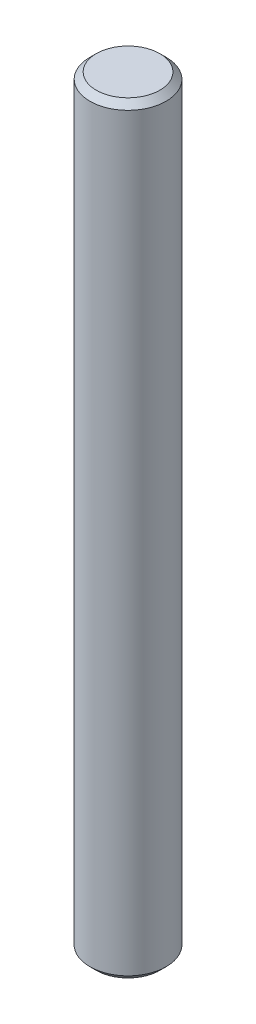
ISO-10303-21;
HEADER;
FILE_DESCRIPTION(('STEP AP214'),'2;1');
FILE_NAME('part.step','',(''),(''),'','','');
FILE_SCHEMA(('AUTOMOTIVE_DESIGN { 1 0 10303 214 1 1 1 1 }'));
ENDSEC;
DATA;
#1=APPLICATION_CONTEXT('core data for automotive mechanical design processes');
#2=APPLICATION_PROTOCOL_DEFINITION('international standard','automotive_design',2000,#1);
#3=PRODUCT_CONTEXT('',#1,'mechanical');
#4=PRODUCT('Part','Part','',(#3));
#5=PRODUCT_RELATED_PRODUCT_CATEGORY('part','',(#4));
#6=PRODUCT_DEFINITION_FORMATION('','',#4);
#7=PRODUCT_DEFINITION_CONTEXT('part definition',#1,'design');
#8=PRODUCT_DEFINITION('design','',#6,#7);
#9=PRODUCT_DEFINITION_SHAPE('','',#8);
#10=(LENGTH_UNIT() NAMED_UNIT(*) SI_UNIT(.MILLI.,.METRE.));
#11=(NAMED_UNIT(*) PLANE_ANGLE_UNIT() SI_UNIT($,.RADIAN.));
#12=(NAMED_UNIT(*) SI_UNIT($,.STERADIAN.) SOLID_ANGLE_UNIT());
#13=UNCERTAINTY_MEASURE_WITH_UNIT(LENGTH_MEASURE(1.E-05),#10,'distance_accuracy_value','');
#14=(GEOMETRIC_REPRESENTATION_CONTEXT(3) GLOBAL_UNCERTAINTY_ASSIGNED_CONTEXT((#13)) GLOBAL_UNIT_ASSIGNED_CONTEXT((#10,
#11,#12)) REPRESENTATION_CONTEXT('',''));
#15=CARTESIAN_POINT('',(0.,0.,0.));
#16=DIRECTION('',(0.,0.,1.));
#17=DIRECTION('',(1.,0.,0.));
#18=AXIS2_PLACEMENT_3D('',#15,#16,#17);
#19=CARTESIAN_POINT('',(0.,30.,6.5));
#20=DIRECTION('',(0.,-1.,0.));
#21=DIRECTION('',(0.,0.,-1.));
#22=AXIS2_PLACEMENT_3D('',#19,#20,#21);
#23=CONICAL_SURFACE('',#22,2.5,0.785398163397446);
#24=CARTESIAN_POINT('',(0.,30.,6.5));
#25=DIRECTION('',(0.,1.,0.));
#26=DIRECTION('',(0.,0.,1.));
#27=AXIS2_PLACEMENT_3D('',#24,#25,#26);
#28=CIRCLE('',#27,2.5);
#29=CARTESIAN_POINT('',(0.,30.,4.));
#30=VERTEX_POINT('',#29);
#31=EDGE_CURVE('E37',#30,#30,#28,.T.);
#32=ORIENTED_EDGE('',*,*,#31,.F.);
#33=EDGE_LOOP('',(#32));
#34=FACE_BOUND('',#33,.T.);
#35=CARTESIAN_POINT('',(0.,29.5,6.5));
#36=DIRECTION('',(0.,-1.,0.));
#37=DIRECTION('',(0.,0.,1.));
#38=AXIS2_PLACEMENT_3D('',#35,#36,#37);
#39=CIRCLE('',#38,3.);
#40=CARTESIAN_POINT('',(0.,29.5,3.5));
#41=VERTEX_POINT('',#40);
#42=EDGE_CURVE('E11',#41,#41,#39,.T.);
#43=ORIENTED_EDGE('',*,*,#42,.F.);
#44=EDGE_LOOP('',(#43));
#45=FACE_BOUND('',#44,.T.);
#46=ADVANCED_FACE('F17',(#34,#45),#23,.T.);
#47=CARTESIAN_POINT('',(0.,-29.5,6.5));
#48=DIRECTION('',(0.,1.,0.));
#49=DIRECTION('',(0.,0.,1.));
#50=AXIS2_PLACEMENT_3D('',#47,#48,#49);
#51=CONICAL_SURFACE('',#50,3.,0.785398163397453);
#52=CARTESIAN_POINT('',(0.,-30.,6.5));
#53=DIRECTION('',(0.,-1.,0.));
#54=DIRECTION('',(0.,0.,1.));
#55=AXIS2_PLACEMENT_3D('',#52,#53,#54);
#56=CIRCLE('',#55,2.5);
#57=CARTESIAN_POINT('',(0.,-30.,9.));
#58=VERTEX_POINT('',#57);
#59=EDGE_CURVE('E63',#58,#58,#56,.T.);
#60=ORIENTED_EDGE('',*,*,#59,.F.);
#61=EDGE_LOOP('',(#60));
#62=FACE_BOUND('',#61,.T.);
#63=CARTESIAN_POINT('',(0.,-29.5,6.5));
#64=DIRECTION('',(0.,1.,0.));
#65=DIRECTION('',(0.,0.,1.));
#66=AXIS2_PLACEMENT_3D('',#63,#64,#65);
#67=CIRCLE('',#66,3.);
#68=CARTESIAN_POINT('',(0.,-29.5,9.5));
#69=VERTEX_POINT('',#68);
#70=EDGE_CURVE('E26',#69,#69,#67,.T.);
#71=ORIENTED_EDGE('',*,*,#70,.F.);
#72=EDGE_LOOP('',(#71));
#73=FACE_BOUND('',#72,.T.);
#74=ADVANCED_FACE('F55',(#62,#73),#51,.T.);
#75=CARTESIAN_POINT('',(0.,30.,6.5));
#76=DIRECTION('',(0.,-1.,0.));
#77=DIRECTION('',(0.,0.,-1.));
#78=AXIS2_PLACEMENT_3D('',#75,#76,#77);
#79=CYLINDRICAL_SURFACE('',#78,3.);
#80=ORIENTED_EDGE('',*,*,#42,.T.);
#81=EDGE_LOOP('',(#80));
#82=FACE_BOUND('',#81,.T.);
#83=ORIENTED_EDGE('',*,*,#70,.T.);
#84=EDGE_LOOP('',(#83));
#85=FACE_BOUND('',#84,.T.);
#86=ADVANCED_FACE('F72',(#82,#85),#79,.T.);
#87=CARTESIAN_POINT('',(0.,30.,6.5));
#88=DIRECTION('',(0.,1.,0.));
#89=DIRECTION('',(1.,0.,0.));
#90=AXIS2_PLACEMENT_3D('',#87,#88,#89);
#91=PLANE('',#90);
#92=ORIENTED_EDGE('',*,*,#31,.T.);
#93=EDGE_LOOP('',(#92));
#94=FACE_BOUND('',#93,.T.);
#95=ADVANCED_FACE('F19',(#94),#91,.T.);
#96=CARTESIAN_POINT('',(0.,-30.,6.5));
#97=DIRECTION('',(0.,1.,0.));
#98=DIRECTION('',(1.,0.,0.));
#99=AXIS2_PLACEMENT_3D('',#96,#97,#98);
#100=PLANE('',#99);
#101=ORIENTED_EDGE('',*,*,#59,.T.);
#102=EDGE_LOOP('',(#101));
#103=FACE_BOUND('',#102,.T.);
#104=ADVANCED_FACE('F69',(#103),#100,.F.);
#105=CLOSED_SHELL('',(#46,#74,#86,#95,#104));
#106=MANIFOLD_SOLID_BREP('B1',#105);
#107=ADVANCED_BREP_SHAPE_REPRESENTATION('',(#18,#106),#14);
#108=SHAPE_DEFINITION_REPRESENTATION(#9,#107);
ENDSEC;
END-ISO-10303-21;
